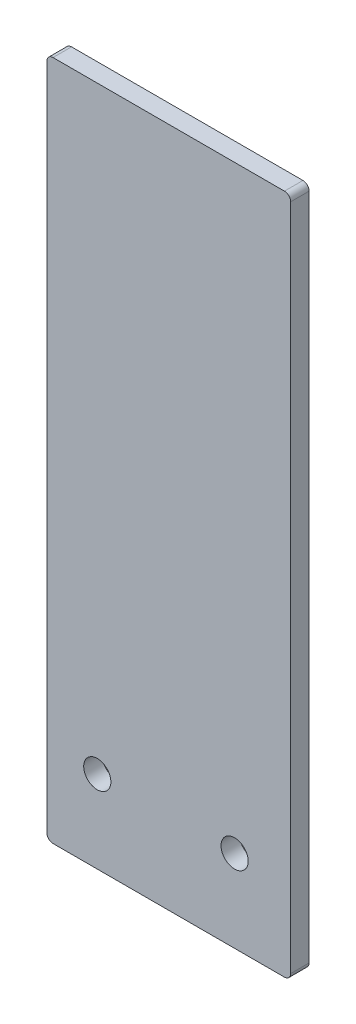
ISO-10303-21;
HEADER;
FILE_DESCRIPTION(('STEP AP214'),'2;1');
FILE_NAME('part.step','',(''),(''),'','','');
FILE_SCHEMA(('AUTOMOTIVE_DESIGN { 1 0 10303 214 1 1 1 1 }'));
ENDSEC;
DATA;
#1=APPLICATION_CONTEXT('core data for automotive mechanical design processes');
#2=APPLICATION_PROTOCOL_DEFINITION('international standard','automotive_design',2000,#1);
#3=PRODUCT_CONTEXT('',#1,'mechanical');
#4=PRODUCT('Part','Part','',(#3));
#5=PRODUCT_RELATED_PRODUCT_CATEGORY('part','',(#4));
#6=PRODUCT_DEFINITION_FORMATION('','',#4);
#7=PRODUCT_DEFINITION_CONTEXT('part definition',#1,'design');
#8=PRODUCT_DEFINITION('design','',#6,#7);
#9=PRODUCT_DEFINITION_SHAPE('','',#8);
#10=(LENGTH_UNIT() NAMED_UNIT(*) SI_UNIT(.MILLI.,.METRE.));
#11=(NAMED_UNIT(*) PLANE_ANGLE_UNIT() SI_UNIT($,.RADIAN.));
#12=(NAMED_UNIT(*) SI_UNIT($,.STERADIAN.) SOLID_ANGLE_UNIT());
#13=UNCERTAINTY_MEASURE_WITH_UNIT(LENGTH_MEASURE(1.E-05),#10,'distance_accuracy_value','');
#14=(GEOMETRIC_REPRESENTATION_CONTEXT(3) GLOBAL_UNCERTAINTY_ASSIGNED_CONTEXT((#13)) GLOBAL_UNIT_ASSIGNED_CONTEXT((#10,
#11,#12)) REPRESENTATION_CONTEXT('',''));
#15=CARTESIAN_POINT('',(0.,0.,0.));
#16=DIRECTION('',(0.,0.,1.));
#17=DIRECTION('',(1.,0.,0.));
#18=AXIS2_PLACEMENT_3D('',#15,#16,#17);
#19=CARTESIAN_POINT('',(32.761843,-158.490889,1.5));
#20=DIRECTION('',(0.,0.,-1.));
#21=DIRECTION('',(-1.,0.,0.));
#22=AXIS2_PLACEMENT_3D('',#19,#20,#21);
#23=PLANE('',#22);
#24=CARTESIAN_POINT('',(32.761843,-158.490889,1.5));
#25=DIRECTION('',(0.,0.,1.));
#26=DIRECTION('',(-1.,0.,0.));
#27=AXIS2_PLACEMENT_3D('',#24,#25,#26);
#28=CIRCLE('',#27,0.5);
#29=CARTESIAN_POINT('',(32.761843,-157.990889,1.5));
#30=VERTEX_POINT('',#29);
#31=CARTESIAN_POINT('',(32.261843,-158.490889,1.5));
#32=VERTEX_POINT('',#31);
#33=EDGE_CURVE('E147',#30,#32,#28,.T.);
#34=ORIENTED_EDGE('',*,*,#33,.T.);
#35=DIRECTION('',(0.,-1.,0.));
#36=VECTOR('',#35,1.);
#37=CARTESIAN_POINT('',(32.261843,-158.490889,1.5));
#38=LINE('',#37,#36);
#39=CARTESIAN_POINT('',(32.261843,-212.640891272489,1.5));
#40=VERTEX_POINT('',#39);
#41=EDGE_CURVE('E95',#32,#40,#38,.T.);
#42=ORIENTED_EDGE('',*,*,#41,.T.);
#43=CARTESIAN_POINT('',(32.761843,-212.640891272489,1.5));
#44=DIRECTION('',(0.,0.,1.));
#45=DIRECTION('',(1.,0.,0.));
#46=AXIS2_PLACEMENT_3D('',#43,#44,#45);
#47=CIRCLE('',#46,0.5);
#48=CARTESIAN_POINT('',(32.761843,-213.140891272489,1.5));
#49=VERTEX_POINT('',#48);
#50=EDGE_CURVE('E162',#40,#49,#47,.T.);
#51=ORIENTED_EDGE('',*,*,#50,.T.);
#52=DIRECTION('',(1.,0.,0.));
#53=VECTOR('',#52,1.);
#54=CARTESIAN_POINT('',(32.761843,-213.140891272489,1.5));
#55=LINE('',#54,#53);
#56=CARTESIAN_POINT('',(51.5121481632617,-213.140891272489,1.5));
#57=VERTEX_POINT('',#56);
#58=EDGE_CURVE('E175',#49,#57,#55,.T.);
#59=ORIENTED_EDGE('',*,*,#58,.T.);
#60=CARTESIAN_POINT('',(51.5121481632617,-212.640891272489,1.5));
#61=DIRECTION('',(0.,0.,1.));
#62=DIRECTION('',(1.,0.,0.));
#63=AXIS2_PLACEMENT_3D('',#60,#61,#62);
#64=CIRCLE('',#63,0.5);
#65=CARTESIAN_POINT('',(52.0121481632617,-212.640891272489,1.5));
#66=VERTEX_POINT('',#65);
#67=EDGE_CURVE('E114',#57,#66,#64,.T.);
#68=ORIENTED_EDGE('',*,*,#67,.T.);
#69=DIRECTION('',(0.,1.,0.));
#70=VECTOR('',#69,1.);
#71=CARTESIAN_POINT('',(52.0121481632617,-158.490889,1.5));
#72=LINE('',#71,#70);
#73=CARTESIAN_POINT('',(52.0121481632617,-158.490889,1.5));
#74=VERTEX_POINT('',#73);
#75=EDGE_CURVE('E108',#66,#74,#72,.T.);
#76=ORIENTED_EDGE('',*,*,#75,.T.);
#77=CARTESIAN_POINT('',(51.5121481632617,-158.490889,1.5));
#78=DIRECTION('',(0.,0.,1.));
#79=DIRECTION('',(1.,0.,0.));
#80=AXIS2_PLACEMENT_3D('',#77,#78,#79);
#81=CIRCLE('',#80,0.5);
#82=CARTESIAN_POINT('',(51.5121481632617,-157.990889,1.5));
#83=VERTEX_POINT('',#82);
#84=EDGE_CURVE('E112',#74,#83,#81,.T.);
#85=ORIENTED_EDGE('',*,*,#84,.T.);
#86=DIRECTION('',(-1.,0.,0.));
#87=VECTOR('',#86,1.);
#88=CARTESIAN_POINT('',(32.761843,-157.990889,1.5));
#89=LINE('',#88,#87);
#90=EDGE_CURVE('E52',#83,#30,#89,.T.);
#91=ORIENTED_EDGE('',*,*,#90,.T.);
#92=EDGE_LOOP('',(#34,#42,#51,#59,#68,#76,#85,#91));
#93=FACE_BOUND('',#92,.T.);
#94=CARTESIAN_POINT('',(36.3474,-206.4766,1.5));
#95=DIRECTION('',(0.,0.,1.));
#96=DIRECTION('',(1.,0.,0.));
#97=AXIS2_PLACEMENT_3D('',#94,#95,#96);
#98=CIRCLE('',#97,1.09999999999999);
#99=CARTESIAN_POINT('',(37.4474,-206.4766,1.5));
#100=VERTEX_POINT('',#99);
#101=EDGE_CURVE('E136',#100,#100,#98,.T.);
#102=ORIENTED_EDGE('',*,*,#101,.F.);
#103=EDGE_LOOP('',(#102));
#104=FACE_BOUND('',#103,.T.);
#105=CARTESIAN_POINT('',(47.4726,-206.4766,1.5));
#106=DIRECTION('',(0.,0.,1.));
#107=DIRECTION('',(1.,0.,0.));
#108=AXIS2_PLACEMENT_3D('',#105,#106,#107);
#109=CIRCLE('',#108,1.1);
#110=CARTESIAN_POINT('',(48.5726,-206.4766,1.5));
#111=VERTEX_POINT('',#110);
#112=EDGE_CURVE('E184',#111,#111,#109,.T.);
#113=ORIENTED_EDGE('',*,*,#112,.F.);
#114=EDGE_LOOP('',(#113));
#115=FACE_BOUND('',#114,.T.);
#116=ADVANCED_FACE('F35',(#93,#104,#115),#23,.F.);
#117=CARTESIAN_POINT('',(32.761843,-158.490889,0.));
#118=DIRECTION('',(0.,0.,-1.));
#119=DIRECTION('',(-1.,0.,0.));
#120=AXIS2_PLACEMENT_3D('',#117,#118,#119);
#121=PLANE('',#120);
#122=CARTESIAN_POINT('',(36.3474,-206.4766,0.));
#123=DIRECTION('',(0.,0.,1.));
#124=DIRECTION('',(1.,0.,0.));
#125=AXIS2_PLACEMENT_3D('',#122,#123,#124);
#126=CIRCLE('',#125,1.09999999999999);
#127=CARTESIAN_POINT('',(37.4474,-206.4766,0.));
#128=VERTEX_POINT('',#127);
#129=EDGE_CURVE('E181',#128,#128,#126,.T.);
#130=ORIENTED_EDGE('',*,*,#129,.T.);
#131=EDGE_LOOP('',(#130));
#132=FACE_BOUND('',#131,.T.);
#133=CARTESIAN_POINT('',(32.761843,-158.490889,0.));
#134=DIRECTION('',(0.,0.,1.));
#135=DIRECTION('',(-1.,0.,0.));
#136=AXIS2_PLACEMENT_3D('',#133,#134,#135);
#137=CIRCLE('',#136,0.5);
#138=CARTESIAN_POINT('',(32.761843,-157.990889,0.));
#139=VERTEX_POINT('',#138);
#140=CARTESIAN_POINT('',(32.261843,-158.490889,0.));
#141=VERTEX_POINT('',#140);
#142=EDGE_CURVE('E132',#139,#141,#137,.T.);
#143=ORIENTED_EDGE('',*,*,#142,.F.);
#144=DIRECTION('',(-1.,0.,0.));
#145=VECTOR('',#144,1.);
#146=CARTESIAN_POINT('',(32.761843,-157.990889,0.));
#147=LINE('',#146,#145);
#148=CARTESIAN_POINT('',(51.5121481632617,-157.990889,0.));
#149=VERTEX_POINT('',#148);
#150=EDGE_CURVE('E87',#149,#139,#147,.T.);
#151=ORIENTED_EDGE('',*,*,#150,.F.);
#152=CARTESIAN_POINT('',(51.5121481632617,-158.490889,0.));
#153=DIRECTION('',(0.,0.,1.));
#154=DIRECTION('',(1.,0.,0.));
#155=AXIS2_PLACEMENT_3D('',#152,#153,#154);
#156=CIRCLE('',#155,0.5);
#157=CARTESIAN_POINT('',(52.0121481632617,-158.490889,0.));
#158=VERTEX_POINT('',#157);
#159=EDGE_CURVE('E81',#158,#149,#156,.T.);
#160=ORIENTED_EDGE('',*,*,#159,.F.);
#161=DIRECTION('',(0.,1.,0.));
#162=VECTOR('',#161,1.);
#163=CARTESIAN_POINT('',(52.0121481632617,-158.490889,0.));
#164=LINE('',#163,#162);
#165=CARTESIAN_POINT('',(52.0121481632617,-212.640891272489,0.));
#166=VERTEX_POINT('',#165);
#167=EDGE_CURVE('E122',#166,#158,#164,.T.);
#168=ORIENTED_EDGE('',*,*,#167,.F.);
#169=CARTESIAN_POINT('',(51.5121481632617,-212.640891272489,0.));
#170=DIRECTION('',(0.,0.,1.));
#171=DIRECTION('',(1.,0.,0.));
#172=AXIS2_PLACEMENT_3D('',#169,#170,#171);
#173=CIRCLE('',#172,0.5);
#174=CARTESIAN_POINT('',(51.5121481632617,-213.140891272489,0.));
#175=VERTEX_POINT('',#174);
#176=EDGE_CURVE('E142',#175,#166,#173,.T.);
#177=ORIENTED_EDGE('',*,*,#176,.F.);
#178=DIRECTION('',(1.,0.,0.));
#179=VECTOR('',#178,1.);
#180=CARTESIAN_POINT('',(32.761843,-213.140891272489,0.));
#181=LINE('',#180,#179);
#182=CARTESIAN_POINT('',(32.761843,-213.140891272489,0.));
#183=VERTEX_POINT('',#182);
#184=EDGE_CURVE('E140',#183,#175,#181,.T.);
#185=ORIENTED_EDGE('',*,*,#184,.F.);
#186=CARTESIAN_POINT('',(32.761843,-212.640891272489,0.));
#187=DIRECTION('',(0.,0.,1.));
#188=DIRECTION('',(1.,0.,0.));
#189=AXIS2_PLACEMENT_3D('',#186,#187,#188);
#190=CIRCLE('',#189,0.5);
#191=CARTESIAN_POINT('',(32.261843,-212.640891272489,0.));
#192=VERTEX_POINT('',#191);
#193=EDGE_CURVE('E138',#192,#183,#190,.T.);
#194=ORIENTED_EDGE('',*,*,#193,.F.);
#195=DIRECTION('',(0.,-1.,0.));
#196=VECTOR('',#195,1.);
#197=CARTESIAN_POINT('',(32.261843,-158.490889,0.));
#198=LINE('',#197,#196);
#199=EDGE_CURVE('E135',#141,#192,#198,.T.);
#200=ORIENTED_EDGE('',*,*,#199,.F.);
#201=EDGE_LOOP('',(#143,#151,#160,#168,#177,#185,#194,#200));
#202=FACE_BOUND('',#201,.T.);
#203=CARTESIAN_POINT('',(47.4726,-206.4766,0.));
#204=DIRECTION('',(0.,0.,1.));
#205=DIRECTION('',(1.,0.,0.));
#206=AXIS2_PLACEMENT_3D('',#203,#204,#205);
#207=CIRCLE('',#206,1.1);
#208=CARTESIAN_POINT('',(48.5726,-206.4766,0.));
#209=VERTEX_POINT('',#208);
#210=EDGE_CURVE('E187',#209,#209,#207,.T.);
#211=ORIENTED_EDGE('',*,*,#210,.T.);
#212=EDGE_LOOP('',(#211));
#213=FACE_BOUND('',#212,.T.);
#214=ADVANCED_FACE('F166',(#132,#202,#213),#121,.T.);
#215=CARTESIAN_POINT('',(32.761843,-158.490889,1.5));
#216=DIRECTION('',(0.,0.,-1.));
#217=DIRECTION('',(-1.,0.,0.));
#218=AXIS2_PLACEMENT_3D('',#215,#216,#217);
#219=CYLINDRICAL_SURFACE('',#218,0.5);
#220=ORIENTED_EDGE('',*,*,#142,.T.);
#221=DIRECTION('',(0.,0.,-1.));
#222=VECTOR('',#221,1.);
#223=CARTESIAN_POINT('',(32.261843,-158.490889,1.5));
#224=LINE('',#223,#222);
#225=EDGE_CURVE('E11',#32,#141,#224,.T.);
#226=ORIENTED_EDGE('',*,*,#225,.F.);
#227=ORIENTED_EDGE('',*,*,#33,.F.);
#228=DIRECTION('',(0.,0.,-1.));
#229=VECTOR('',#228,1.);
#230=CARTESIAN_POINT('',(32.761843,-157.990889,1.5));
#231=LINE('',#230,#229);
#232=EDGE_CURVE('E128',#30,#139,#231,.T.);
#233=ORIENTED_EDGE('',*,*,#232,.T.);
#234=EDGE_LOOP('',(#220,#226,#227,#233));
#235=FACE_BOUND('',#234,.T.);
#236=ADVANCED_FACE('F37',(#235),#219,.T.);
#237=CARTESIAN_POINT('',(32.261843,-158.490889,1.5));
#238=DIRECTION('',(1.,0.,0.));
#239=DIRECTION('',(0.,0.,-1.));
#240=AXIS2_PLACEMENT_3D('',#237,#238,#239);
#241=PLANE('',#240);
#242=ORIENTED_EDGE('',*,*,#199,.T.);
#243=DIRECTION('',(0.,0.,-1.));
#244=VECTOR('',#243,1.);
#245=CARTESIAN_POINT('',(32.261843,-212.640891272489,1.5));
#246=LINE('',#245,#244);
#247=EDGE_CURVE('E44',#40,#192,#246,.T.);
#248=ORIENTED_EDGE('',*,*,#247,.F.);
#249=ORIENTED_EDGE('',*,*,#41,.F.);
#250=ORIENTED_EDGE('',*,*,#225,.T.);
#251=EDGE_LOOP('',(#242,#248,#249,#250));
#252=FACE_BOUND('',#251,.T.);
#253=ADVANCED_FACE('F219',(#252),#241,.F.);
#254=CARTESIAN_POINT('',(32.761843,-212.640891272489,1.5));
#255=DIRECTION('',(0.,0.,-1.));
#256=DIRECTION('',(-1.,0.,0.));
#257=AXIS2_PLACEMENT_3D('',#254,#255,#256);
#258=CYLINDRICAL_SURFACE('',#257,0.5);
#259=ORIENTED_EDGE('',*,*,#193,.T.);
#260=DIRECTION('',(0.,0.,-1.));
#261=VECTOR('',#260,1.);
#262=CARTESIAN_POINT('',(32.761843,-213.140891272489,1.5));
#263=LINE('',#262,#261);
#264=EDGE_CURVE('E154',#49,#183,#263,.T.);
#265=ORIENTED_EDGE('',*,*,#264,.F.);
#266=ORIENTED_EDGE('',*,*,#50,.F.);
#267=ORIENTED_EDGE('',*,*,#247,.T.);
#268=EDGE_LOOP('',(#259,#265,#266,#267));
#269=FACE_BOUND('',#268,.T.);
#270=ADVANCED_FACE('F160',(#269),#258,.T.);
#271=CARTESIAN_POINT('',(32.761843,-213.140891272489,1.5));
#272=DIRECTION('',(0.,1.,0.));
#273=DIRECTION('',(0.,0.,1.));
#274=AXIS2_PLACEMENT_3D('',#271,#272,#273);
#275=PLANE('',#274);
#276=ORIENTED_EDGE('',*,*,#184,.T.);
#277=DIRECTION('',(0.,0.,-1.));
#278=VECTOR('',#277,1.);
#279=CARTESIAN_POINT('',(51.5121481632617,-213.140891272489,1.5));
#280=LINE('',#279,#278);
#281=EDGE_CURVE('E151',#57,#175,#280,.T.);
#282=ORIENTED_EDGE('',*,*,#281,.F.);
#283=ORIENTED_EDGE('',*,*,#58,.F.);
#284=ORIENTED_EDGE('',*,*,#264,.T.);
#285=EDGE_LOOP('',(#276,#282,#283,#284));
#286=FACE_BOUND('',#285,.T.);
#287=ADVANCED_FACE('F171',(#286),#275,.F.);
#288=CARTESIAN_POINT('',(51.5121481632617,-212.640891272489,1.5));
#289=DIRECTION('',(0.,0.,-1.));
#290=DIRECTION('',(-1.,0.,0.));
#291=AXIS2_PLACEMENT_3D('',#288,#289,#290);
#292=CYLINDRICAL_SURFACE('',#291,0.5);
#293=ORIENTED_EDGE('',*,*,#176,.T.);
#294=DIRECTION('',(0.,0.,-1.));
#295=VECTOR('',#294,1.);
#296=CARTESIAN_POINT('',(52.0121481632617,-212.640891272489,1.5));
#297=LINE('',#296,#295);
#298=EDGE_CURVE('E123',#66,#166,#297,.T.);
#299=ORIENTED_EDGE('',*,*,#298,.F.);
#300=ORIENTED_EDGE('',*,*,#67,.F.);
#301=ORIENTED_EDGE('',*,*,#281,.T.);
#302=EDGE_LOOP('',(#293,#299,#300,#301));
#303=FACE_BOUND('',#302,.T.);
#304=ADVANCED_FACE('F174',(#303),#292,.T.);
#305=CARTESIAN_POINT('',(52.0121481632617,-158.490889,1.5));
#306=DIRECTION('',(-1.,0.,0.));
#307=DIRECTION('',(0.,0.,1.));
#308=AXIS2_PLACEMENT_3D('',#305,#306,#307);
#309=PLANE('',#308);
#310=ORIENTED_EDGE('',*,*,#167,.T.);
#311=DIRECTION('',(0.,0.,-1.));
#312=VECTOR('',#311,1.);
#313=CARTESIAN_POINT('',(52.0121481632617,-158.490889,1.5));
#314=LINE('',#313,#312);
#315=EDGE_CURVE('E119',#74,#158,#314,.T.);
#316=ORIENTED_EDGE('',*,*,#315,.F.);
#317=ORIENTED_EDGE('',*,*,#75,.F.);
#318=ORIENTED_EDGE('',*,*,#298,.T.);
#319=EDGE_LOOP('',(#310,#316,#317,#318));
#320=FACE_BOUND('',#319,.T.);
#321=ADVANCED_FACE('F120',(#320),#309,.F.);
#322=CARTESIAN_POINT('',(51.5121481632617,-158.490889,1.5));
#323=DIRECTION('',(0.,0.,-1.));
#324=DIRECTION('',(-1.,0.,0.));
#325=AXIS2_PLACEMENT_3D('',#322,#323,#324);
#326=CYLINDRICAL_SURFACE('',#325,0.5);
#327=ORIENTED_EDGE('',*,*,#159,.T.);
#328=DIRECTION('',(0.,0.,-1.));
#329=VECTOR('',#328,1.);
#330=CARTESIAN_POINT('',(51.5121481632617,-157.990889,1.5));
#331=LINE('',#330,#329);
#332=EDGE_CURVE('E124',#83,#149,#331,.T.);
#333=ORIENTED_EDGE('',*,*,#332,.F.);
#334=ORIENTED_EDGE('',*,*,#84,.F.);
#335=ORIENTED_EDGE('',*,*,#315,.T.);
#336=EDGE_LOOP('',(#327,#333,#334,#335));
#337=FACE_BOUND('',#336,.T.);
#338=ADVANCED_FACE('F126',(#337),#326,.T.);
#339=CARTESIAN_POINT('',(32.761843,-157.990889,1.5));
#340=DIRECTION('',(0.,-1.,0.));
#341=DIRECTION('',(0.,0.,-1.));
#342=AXIS2_PLACEMENT_3D('',#339,#340,#341);
#343=PLANE('',#342);
#344=ORIENTED_EDGE('',*,*,#150,.T.);
#345=ORIENTED_EDGE('',*,*,#232,.F.);
#346=ORIENTED_EDGE('',*,*,#90,.F.);
#347=ORIENTED_EDGE('',*,*,#332,.T.);
#348=EDGE_LOOP('',(#344,#345,#346,#347));
#349=FACE_BOUND('',#348,.T.);
#350=ADVANCED_FACE('F207',(#349),#343,.F.);
#351=CARTESIAN_POINT('',(36.3474,-206.4766,1.5));
#352=DIRECTION('',(0.,0.,-1.));
#353=DIRECTION('',(-1.,0.,0.));
#354=AXIS2_PLACEMENT_3D('',#351,#352,#353);
#355=CYLINDRICAL_SURFACE('',#354,1.09999999999999);
#356=ORIENTED_EDGE('',*,*,#101,.T.);
#357=EDGE_LOOP('',(#356));
#358=FACE_BOUND('',#357,.T.);
#359=ORIENTED_EDGE('',*,*,#129,.F.);
#360=EDGE_LOOP('',(#359));
#361=FACE_BOUND('',#360,.T.);
#362=ADVANCED_FACE('F204',(#358,#361),#355,.F.);
#363=CARTESIAN_POINT('',(47.4726,-206.4766,1.5));
#364=DIRECTION('',(0.,0.,-1.));
#365=DIRECTION('',(-1.,0.,0.));
#366=AXIS2_PLACEMENT_3D('',#363,#364,#365);
#367=CYLINDRICAL_SURFACE('',#366,1.1);
#368=ORIENTED_EDGE('',*,*,#112,.T.);
#369=EDGE_LOOP('',(#368));
#370=FACE_BOUND('',#369,.T.);
#371=ORIENTED_EDGE('',*,*,#210,.F.);
#372=EDGE_LOOP('',(#371));
#373=FACE_BOUND('',#372,.T.);
#374=ADVANCED_FACE('F193',(#370,#373),#367,.F.);
#375=CLOSED_SHELL('',(#116,#214,#236,#253,#270,#287,#304,#321,#338,#350,#362,#374));
#376=MANIFOLD_SOLID_BREP('B2',#375);
#377=ADVANCED_BREP_SHAPE_REPRESENTATION('',(#18,#376),#14);
#378=SHAPE_DEFINITION_REPRESENTATION(#9,#377);
ENDSEC;
END-ISO-10303-21;
